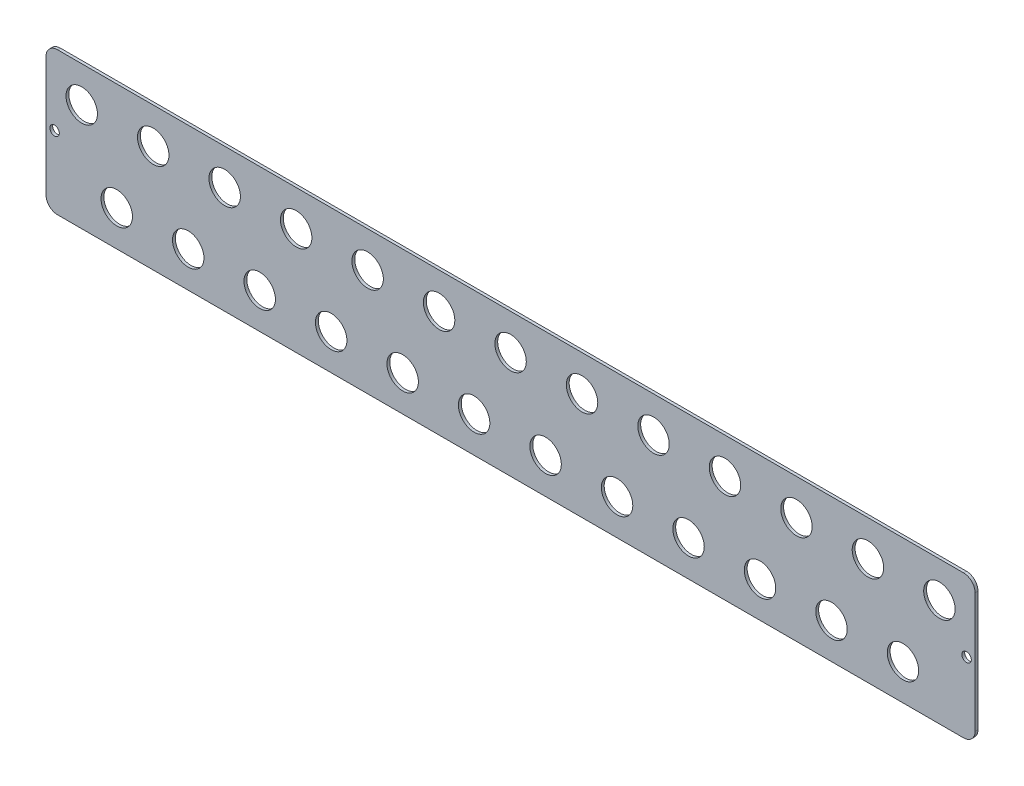
ISO-10303-21;
HEADER;
FILE_DESCRIPTION(('STEP AP214'),'2;1');
FILE_NAME('part.step','',(''),(''),'','','');
FILE_SCHEMA(('AUTOMOTIVE_DESIGN { 1 0 10303 214 1 1 1 1 }'));
ENDSEC;
DATA;
#1=APPLICATION_CONTEXT('core data for automotive mechanical design processes');
#2=APPLICATION_PROTOCOL_DEFINITION('international standard','automotive_design',2000,#1);
#3=PRODUCT_CONTEXT('',#1,'mechanical');
#4=PRODUCT('Part','Part','',(#3));
#5=PRODUCT_RELATED_PRODUCT_CATEGORY('part','',(#4));
#6=PRODUCT_DEFINITION_FORMATION('','',#4);
#7=PRODUCT_DEFINITION_CONTEXT('part definition',#1,'design');
#8=PRODUCT_DEFINITION('design','',#6,#7);
#9=PRODUCT_DEFINITION_SHAPE('','',#8);
#10=(LENGTH_UNIT() NAMED_UNIT(*) SI_UNIT(.MILLI.,.METRE.));
#11=(NAMED_UNIT(*) PLANE_ANGLE_UNIT() SI_UNIT($,.RADIAN.));
#12=(NAMED_UNIT(*) SI_UNIT($,.STERADIAN.) SOLID_ANGLE_UNIT());
#13=UNCERTAINTY_MEASURE_WITH_UNIT(LENGTH_MEASURE(1.E-05),#10,'distance_accuracy_value','');
#14=(GEOMETRIC_REPRESENTATION_CONTEXT(3) GLOBAL_UNCERTAINTY_ASSIGNED_CONTEXT((#13)) GLOBAL_UNIT_ASSIGNED_CONTEXT((#10,
#11,#12)) REPRESENTATION_CONTEXT('',''));
#15=CARTESIAN_POINT('',(0.,0.,0.));
#16=DIRECTION('',(0.,0.,1.));
#17=DIRECTION('',(1.,0.,0.));
#18=AXIS2_PLACEMENT_3D('',#15,#16,#17);
#19=CARTESIAN_POINT('',(316.901308233038,-41.9013082330377,2.));
#20=DIRECTION('',(0.,0.,-1.));
#21=DIRECTION('',(-1.,0.,0.));
#22=AXIS2_PLACEMENT_3D('',#19,#20,#21);
#23=CYLINDRICAL_SURFACE('',#22,8.09869176696232);
#24=CARTESIAN_POINT('',(316.901308233038,-41.9013082330377,0.));
#25=DIRECTION('',(0.,0.,1.));
#26=DIRECTION('',(1.,0.,0.));
#27=AXIS2_PLACEMENT_3D('',#24,#25,#26);
#28=CIRCLE('',#27,8.09869176696232);
#29=CARTESIAN_POINT('',(316.901308233038,-50.,0.));
#30=VERTEX_POINT('',#29);
#31=CARTESIAN_POINT('',(325.,-41.9013082330377,0.));
#32=VERTEX_POINT('',#31);
#33=EDGE_CURVE('E134',#30,#32,#28,.T.);
#34=ORIENTED_EDGE('',*,*,#33,.T.);
#35=DIRECTION('',(0.,0.,-1.));
#36=VECTOR('',#35,1.);
#37=CARTESIAN_POINT('',(325.,-41.9013082330377,2.));
#38=LINE('',#37,#36);
#39=CARTESIAN_POINT('',(325.,-41.9013082330377,2.));
#40=VERTEX_POINT('',#39);
#41=EDGE_CURVE('E162',#40,#32,#38,.T.);
#42=ORIENTED_EDGE('',*,*,#41,.F.);
#43=CARTESIAN_POINT('',(316.901308233038,-41.9013082330377,2.));
#44=DIRECTION('',(0.,0.,1.));
#45=DIRECTION('',(1.,0.,0.));
#46=AXIS2_PLACEMENT_3D('',#43,#44,#45);
#47=CIRCLE('',#46,8.09869176696232);
#48=CARTESIAN_POINT('',(316.901308233038,-50.,2.));
#49=VERTEX_POINT('',#48);
#50=EDGE_CURVE('E149',#49,#40,#47,.T.);
#51=ORIENTED_EDGE('',*,*,#50,.F.);
#52=DIRECTION('',(0.,0.,-1.));
#53=VECTOR('',#52,1.);
#54=CARTESIAN_POINT('',(316.901308233038,-50.,2.));
#55=LINE('',#54,#53);
#56=EDGE_CURVE('E130',#49,#30,#55,.T.);
#57=ORIENTED_EDGE('',*,*,#56,.T.);
#58=EDGE_LOOP('',(#34,#42,#51,#57));
#59=FACE_BOUND('',#58,.T.);
#60=ADVANCED_FACE('F33',(#59),#23,.T.);
#61=CARTESIAN_POINT('',(325.,-41.9013082330377,2.));
#62=DIRECTION('',(-1.,0.,0.));
#63=DIRECTION('',(0.,0.,1.));
#64=AXIS2_PLACEMENT_3D('',#61,#62,#63);
#65=PLANE('',#64);
#66=DIRECTION('',(0.,1.,0.));
#67=VECTOR('',#66,1.);
#68=CARTESIAN_POINT('',(325.,-41.9013082330377,0.));
#69=LINE('',#68,#67);
#70=CARTESIAN_POINT('',(325.,41.9013082330377,0.));
#71=VERTEX_POINT('',#70);
#72=EDGE_CURVE('E137',#32,#71,#69,.T.);
#73=ORIENTED_EDGE('',*,*,#72,.T.);
#74=DIRECTION('',(0.,0.,-1.));
#75=VECTOR('',#74,1.);
#76=CARTESIAN_POINT('',(325.,41.9013082330377,2.));
#77=LINE('',#76,#75);
#78=CARTESIAN_POINT('',(325.,41.9013082330377,2.));
#79=VERTEX_POINT('',#78);
#80=EDGE_CURVE('E159',#79,#71,#77,.T.);
#81=ORIENTED_EDGE('',*,*,#80,.F.);
#82=DIRECTION('',(0.,1.,0.));
#83=VECTOR('',#82,1.);
#84=CARTESIAN_POINT('',(325.,-41.9013082330377,2.));
#85=LINE('',#84,#83);
#86=EDGE_CURVE('E96',#40,#79,#85,.T.);
#87=ORIENTED_EDGE('',*,*,#86,.F.);
#88=ORIENTED_EDGE('',*,*,#41,.T.);
#89=EDGE_LOOP('',(#73,#81,#87,#88));
#90=FACE_BOUND('',#89,.T.);
#91=ADVANCED_FACE('F345',(#90),#65,.F.);
#92=CARTESIAN_POINT('',(316.901308233038,41.9013082330377,2.));
#93=DIRECTION('',(0.,0.,-1.));
#94=DIRECTION('',(-1.,0.,0.));
#95=AXIS2_PLACEMENT_3D('',#92,#93,#94);
#96=CYLINDRICAL_SURFACE('',#95,8.09869176696232);
#97=CARTESIAN_POINT('',(316.901308233038,41.9013082330377,0.));
#98=DIRECTION('',(0.,0.,1.));
#99=DIRECTION('',(1.,0.,0.));
#100=AXIS2_PLACEMENT_3D('',#97,#98,#99);
#101=CIRCLE('',#100,8.09869176696232);
#102=CARTESIAN_POINT('',(316.901308233038,50.,0.));
#103=VERTEX_POINT('',#102);
#104=EDGE_CURVE('E140',#71,#103,#101,.T.);
#105=ORIENTED_EDGE('',*,*,#104,.T.);
#106=DIRECTION('',(0.,0.,-1.));
#107=VECTOR('',#106,1.);
#108=CARTESIAN_POINT('',(316.901308233038,50.,2.));
#109=LINE('',#108,#107);
#110=CARTESIAN_POINT('',(316.901308233038,50.,2.));
#111=VERTEX_POINT('',#110);
#112=EDGE_CURVE('E156',#111,#103,#109,.T.);
#113=ORIENTED_EDGE('',*,*,#112,.F.);
#114=CARTESIAN_POINT('',(316.901308233038,41.9013082330377,2.));
#115=DIRECTION('',(0.,0.,1.));
#116=DIRECTION('',(1.,0.,0.));
#117=AXIS2_PLACEMENT_3D('',#114,#115,#116);
#118=CIRCLE('',#117,8.09869176696232);
#119=EDGE_CURVE('E312',#79,#111,#118,.T.);
#120=ORIENTED_EDGE('',*,*,#119,.F.);
#121=ORIENTED_EDGE('',*,*,#80,.T.);
#122=EDGE_LOOP('',(#105,#113,#120,#121));
#123=FACE_BOUND('',#122,.T.);
#124=ADVANCED_FACE('F350',(#123),#96,.T.);
#125=CARTESIAN_POINT('',(-316.901308233038,50.,2.));
#126=DIRECTION('',(0.,-1.,0.));
#127=DIRECTION('',(0.,0.,-1.));
#128=AXIS2_PLACEMENT_3D('',#125,#126,#127);
#129=PLANE('',#128);
#130=DIRECTION('',(-1.,0.,0.));
#131=VECTOR('',#130,1.);
#132=CARTESIAN_POINT('',(-316.901308233038,50.,0.));
#133=LINE('',#132,#131);
#134=CARTESIAN_POINT('',(-316.901308233038,50.,0.));
#135=VERTEX_POINT('',#134);
#136=EDGE_CURVE('E142',#103,#135,#133,.T.);
#137=ORIENTED_EDGE('',*,*,#136,.T.);
#138=DIRECTION('',(0.,0.,-1.));
#139=VECTOR('',#138,1.);
#140=CARTESIAN_POINT('',(-316.901308233038,50.,2.));
#141=LINE('',#140,#139);
#142=CARTESIAN_POINT('',(-316.901308233038,50.,2.));
#143=VERTEX_POINT('',#142);
#144=EDGE_CURVE('E153',#143,#135,#141,.T.);
#145=ORIENTED_EDGE('',*,*,#144,.F.);
#146=DIRECTION('',(-1.,0.,0.));
#147=VECTOR('',#146,1.);
#148=CARTESIAN_POINT('',(-316.901308233038,50.,2.));
#149=LINE('',#148,#147);
#150=EDGE_CURVE('E314',#111,#143,#149,.T.);
#151=ORIENTED_EDGE('',*,*,#150,.F.);
#152=ORIENTED_EDGE('',*,*,#112,.T.);
#153=EDGE_LOOP('',(#137,#145,#151,#152));
#154=FACE_BOUND('',#153,.T.);
#155=ADVANCED_FACE('F320',(#154),#129,.F.);
#156=CARTESIAN_POINT('',(-316.901308233038,41.9013082330377,2.));
#157=DIRECTION('',(0.,0.,-1.));
#158=DIRECTION('',(-1.,0.,0.));
#159=AXIS2_PLACEMENT_3D('',#156,#157,#158);
#160=CYLINDRICAL_SURFACE('',#159,8.09869176696232);
#161=CARTESIAN_POINT('',(-316.901308233038,41.9013082330377,0.));
#162=DIRECTION('',(0.,0.,1.));
#163=DIRECTION('',(-1.,0.,0.));
#164=AXIS2_PLACEMENT_3D('',#161,#162,#163);
#165=CIRCLE('',#164,8.09869176696232);
#166=CARTESIAN_POINT('',(-325.,41.9013082330377,0.));
#167=VERTEX_POINT('',#166);
#168=EDGE_CURVE('E144',#135,#167,#165,.T.);
#169=ORIENTED_EDGE('',*,*,#168,.T.);
#170=DIRECTION('',(0.,0.,-1.));
#171=VECTOR('',#170,1.);
#172=CARTESIAN_POINT('',(-325.,41.9013082330377,2.));
#173=LINE('',#172,#171);
#174=CARTESIAN_POINT('',(-325.,41.9013082330377,2.));
#175=VERTEX_POINT('',#174);
#176=EDGE_CURVE('E125',#175,#167,#173,.T.);
#177=ORIENTED_EDGE('',*,*,#176,.F.);
#178=CARTESIAN_POINT('',(-316.901308233038,41.9013082330377,2.));
#179=DIRECTION('',(0.,0.,1.));
#180=DIRECTION('',(-1.,0.,0.));
#181=AXIS2_PLACEMENT_3D('',#178,#179,#180);
#182=CIRCLE('',#181,8.09869176696232);
#183=EDGE_CURVE('E116',#143,#175,#182,.T.);
#184=ORIENTED_EDGE('',*,*,#183,.F.);
#185=ORIENTED_EDGE('',*,*,#144,.T.);
#186=EDGE_LOOP('',(#169,#177,#184,#185));
#187=FACE_BOUND('',#186,.T.);
#188=ADVANCED_FACE('F324',(#187),#160,.T.);
#189=CARTESIAN_POINT('',(-325.,-41.9013082330377,2.));
#190=DIRECTION('',(1.,0.,0.));
#191=DIRECTION('',(0.,0.,-1.));
#192=AXIS2_PLACEMENT_3D('',#189,#190,#191);
#193=PLANE('',#192);
#194=DIRECTION('',(0.,-1.,0.));
#195=VECTOR('',#194,1.);
#196=CARTESIAN_POINT('',(-325.,-41.9013082330377,0.));
#197=LINE('',#196,#195);
#198=CARTESIAN_POINT('',(-325.,-41.9013082330377,0.));
#199=VERTEX_POINT('',#198);
#200=EDGE_CURVE('E124',#167,#199,#197,.T.);
#201=ORIENTED_EDGE('',*,*,#200,.T.);
#202=DIRECTION('',(0.,0.,-1.));
#203=VECTOR('',#202,1.);
#204=CARTESIAN_POINT('',(-325.,-41.9013082330377,2.));
#205=LINE('',#204,#203);
#206=CARTESIAN_POINT('',(-325.,-41.9013082330377,2.));
#207=VERTEX_POINT('',#206);
#208=EDGE_CURVE('E121',#207,#199,#205,.T.);
#209=ORIENTED_EDGE('',*,*,#208,.F.);
#210=DIRECTION('',(0.,-1.,0.));
#211=VECTOR('',#210,1.);
#212=CARTESIAN_POINT('',(-325.,-41.9013082330377,2.));
#213=LINE('',#212,#211);
#214=EDGE_CURVE('E109',#175,#207,#213,.T.);
#215=ORIENTED_EDGE('',*,*,#214,.F.);
#216=ORIENTED_EDGE('',*,*,#176,.T.);
#217=EDGE_LOOP('',(#201,#209,#215,#216));
#218=FACE_BOUND('',#217,.T.);
#219=ADVANCED_FACE('F122',(#218),#193,.F.);
#220=CARTESIAN_POINT('',(-316.901308233038,-41.9013082330377,2.));
#221=DIRECTION('',(0.,0.,-1.));
#222=DIRECTION('',(-1.,0.,0.));
#223=AXIS2_PLACEMENT_3D('',#220,#221,#222);
#224=CYLINDRICAL_SURFACE('',#223,8.09869176696232);
#225=CARTESIAN_POINT('',(-316.901308233038,-41.9013082330377,0.));
#226=DIRECTION('',(0.,0.,1.));
#227=DIRECTION('',(-1.,0.,0.));
#228=AXIS2_PLACEMENT_3D('',#225,#226,#227);
#229=CIRCLE('',#228,8.09869176696232);
#230=CARTESIAN_POINT('',(-316.901308233038,-50.,0.));
#231=VERTEX_POINT('',#230);
#232=EDGE_CURVE('E81',#199,#231,#229,.T.);
#233=ORIENTED_EDGE('',*,*,#232,.T.);
#234=DIRECTION('',(0.,0.,-1.));
#235=VECTOR('',#234,1.);
#236=CARTESIAN_POINT('',(-316.901308233038,-50.,2.));
#237=LINE('',#236,#235);
#238=CARTESIAN_POINT('',(-316.901308233038,-50.,2.));
#239=VERTEX_POINT('',#238);
#240=EDGE_CURVE('E126',#239,#231,#237,.T.);
#241=ORIENTED_EDGE('',*,*,#240,.F.);
#242=CARTESIAN_POINT('',(-316.901308233038,-41.9013082330377,2.));
#243=DIRECTION('',(0.,0.,1.));
#244=DIRECTION('',(-1.,0.,0.));
#245=AXIS2_PLACEMENT_3D('',#242,#243,#244);
#246=CIRCLE('',#245,8.09869176696232);
#247=EDGE_CURVE('E114',#207,#239,#246,.T.);
#248=ORIENTED_EDGE('',*,*,#247,.F.);
#249=ORIENTED_EDGE('',*,*,#208,.T.);
#250=EDGE_LOOP('',(#233,#241,#248,#249));
#251=FACE_BOUND('',#250,.T.);
#252=ADVANCED_FACE('F128',(#251),#224,.T.);
#253=CARTESIAN_POINT('',(-316.901308233038,-50.,2.));
#254=DIRECTION('',(0.,1.,0.));
#255=DIRECTION('',(0.,0.,1.));
#256=AXIS2_PLACEMENT_3D('',#253,#254,#255);
#257=PLANE('',#256);
#258=DIRECTION('',(1.,0.,0.));
#259=VECTOR('',#258,1.);
#260=CARTESIAN_POINT('',(-316.901308233038,-50.,0.));
#261=LINE('',#260,#259);
#262=EDGE_CURVE('E87',#231,#30,#261,.T.);
#263=ORIENTED_EDGE('',*,*,#262,.T.);
#264=ORIENTED_EDGE('',*,*,#56,.F.);
#265=DIRECTION('',(1.,0.,0.));
#266=VECTOR('',#265,1.);
#267=CARTESIAN_POINT('',(-316.901308233038,-50.,2.));
#268=LINE('',#267,#266);
#269=EDGE_CURVE('E52',#239,#49,#268,.T.);
#270=ORIENTED_EDGE('',*,*,#269,.F.);
#271=ORIENTED_EDGE('',*,*,#240,.T.);
#272=EDGE_LOOP('',(#263,#264,#270,#271));
#273=FACE_BOUND('',#272,.T.);
#274=ADVANCED_FACE('F333',(#273),#257,.F.);
#275=CARTESIAN_POINT('',(316.901308233038,-41.9013082330377,2.));
#276=DIRECTION('',(0.,0.,1.));
#277=DIRECTION('',(1.,0.,0.));
#278=AXIS2_PLACEMENT_3D('',#275,#276,#277);
#279=PLANE('',#278);
#280=CARTESIAN_POINT('',(-319.,0.,2.));
#281=DIRECTION('',(0.,0.,1.));
#282=DIRECTION('',(1.,0.,0.));
#283=AXIS2_PLACEMENT_3D('',#280,#281,#282);
#284=CIRCLE('',#283,3.29999999999997);
#285=CARTESIAN_POINT('',(-315.7,0.,2.));
#286=VERTEX_POINT('',#285);
#287=EDGE_CURVE('E477',#286,#286,#284,.T.);
#288=ORIENTED_EDGE('',*,*,#287,.F.);
#289=EDGE_LOOP('',(#288));
#290=FACE_BOUND('',#289,.T.);
#291=CARTESIAN_POINT('',(319.,0.,2.));
#292=DIRECTION('',(0.,0.,1.));
#293=DIRECTION('',(1.,0.,0.));
#294=AXIS2_PLACEMENT_3D('',#291,#292,#293);
#295=CIRCLE('',#294,3.29999999999997);
#296=CARTESIAN_POINT('',(322.3,0.,2.));
#297=VERTEX_POINT('',#296);
#298=EDGE_CURVE('E485',#297,#297,#295,.T.);
#299=ORIENTED_EDGE('',*,*,#298,.F.);
#300=EDGE_LOOP('',(#299));
#301=FACE_BOUND('',#300,.T.);
#302=CARTESIAN_POINT('',(-275.5,-25.,2.));
#303=DIRECTION('',(0.,0.,1.));
#304=DIRECTION('',(1.,0.,0.));
#305=AXIS2_PLACEMENT_3D('',#302,#303,#304);
#306=CIRCLE('',#305,11.);
#307=CARTESIAN_POINT('',(-264.5,-25.,2.));
#308=VERTEX_POINT('',#307);
#309=EDGE_CURVE('E277',#308,#308,#306,.T.);
#310=ORIENTED_EDGE('',*,*,#309,.F.);
#311=EDGE_LOOP('',(#310));
#312=FACE_BOUND('',#311,.T.);
#313=CARTESIAN_POINT('',(-225.5,-25.,2.));
#314=DIRECTION('',(0.,0.,1.));
#315=DIRECTION('',(1.,0.,0.));
#316=AXIS2_PLACEMENT_3D('',#313,#314,#315);
#317=CIRCLE('',#316,11.);
#318=CARTESIAN_POINT('',(-214.5,-25.,2.));
#319=VERTEX_POINT('',#318);
#320=EDGE_CURVE('E267',#319,#319,#317,.T.);
#321=ORIENTED_EDGE('',*,*,#320,.F.);
#322=EDGE_LOOP('',(#321));
#323=FACE_BOUND('',#322,.T.);
#324=CARTESIAN_POINT('',(-175.5,-25.,2.));
#325=DIRECTION('',(0.,0.,1.));
#326=DIRECTION('',(1.,0.,0.));
#327=AXIS2_PLACEMENT_3D('',#324,#325,#326);
#328=CIRCLE('',#327,11.);
#329=CARTESIAN_POINT('',(-164.5,-25.,2.));
#330=VERTEX_POINT('',#329);
#331=EDGE_CURVE('E264',#330,#330,#328,.T.);
#332=ORIENTED_EDGE('',*,*,#331,.F.);
#333=EDGE_LOOP('',(#332));
#334=FACE_BOUND('',#333,.T.);
#335=CARTESIAN_POINT('',(-125.5,-25.,2.));
#336=DIRECTION('',(0.,0.,1.));
#337=DIRECTION('',(1.,0.,0.));
#338=AXIS2_PLACEMENT_3D('',#335,#336,#337);
#339=CIRCLE('',#338,11.);
#340=CARTESIAN_POINT('',(-114.5,-25.,2.));
#341=VERTEX_POINT('',#340);
#342=EDGE_CURVE('E261',#341,#341,#339,.T.);
#343=ORIENTED_EDGE('',*,*,#342,.F.);
#344=EDGE_LOOP('',(#343));
#345=FACE_BOUND('',#344,.T.);
#346=CARTESIAN_POINT('',(-75.5000000000001,-25.,2.));
#347=DIRECTION('',(0.,0.,1.));
#348=DIRECTION('',(1.,0.,0.));
#349=AXIS2_PLACEMENT_3D('',#346,#347,#348);
#350=CIRCLE('',#349,11.);
#351=CARTESIAN_POINT('',(-64.5000000000001,-25.,2.));
#352=VERTEX_POINT('',#351);
#353=EDGE_CURVE('E257',#352,#352,#350,.T.);
#354=ORIENTED_EDGE('',*,*,#353,.F.);
#355=EDGE_LOOP('',(#354));
#356=FACE_BOUND('',#355,.T.);
#357=CARTESIAN_POINT('',(-25.5000000000001,-25.,2.));
#358=DIRECTION('',(0.,0.,1.));
#359=DIRECTION('',(1.,0.,0.));
#360=AXIS2_PLACEMENT_3D('',#357,#358,#359);
#361=CIRCLE('',#360,11.);
#362=CARTESIAN_POINT('',(-14.5000000000001,-25.,2.));
#363=VERTEX_POINT('',#362);
#364=EDGE_CURVE('E253',#363,#363,#361,.T.);
#365=ORIENTED_EDGE('',*,*,#364,.F.);
#366=EDGE_LOOP('',(#365));
#367=FACE_BOUND('',#366,.T.);
#368=CARTESIAN_POINT('',(24.5,-25.,2.));
#369=DIRECTION('',(0.,0.,1.));
#370=DIRECTION('',(1.,0.,0.));
#371=AXIS2_PLACEMENT_3D('',#368,#369,#370);
#372=CIRCLE('',#371,11.);
#373=CARTESIAN_POINT('',(35.5,-25.,2.));
#374=VERTEX_POINT('',#373);
#375=EDGE_CURVE('E249',#374,#374,#372,.T.);
#376=ORIENTED_EDGE('',*,*,#375,.F.);
#377=EDGE_LOOP('',(#376));
#378=FACE_BOUND('',#377,.T.);
#379=CARTESIAN_POINT('',(74.5,-25.,2.));
#380=DIRECTION('',(0.,0.,1.));
#381=DIRECTION('',(1.,0.,0.));
#382=AXIS2_PLACEMENT_3D('',#379,#380,#381);
#383=CIRCLE('',#382,11.);
#384=CARTESIAN_POINT('',(85.5,-25.,2.));
#385=VERTEX_POINT('',#384);
#386=EDGE_CURVE('E245',#385,#385,#383,.T.);
#387=ORIENTED_EDGE('',*,*,#386,.F.);
#388=EDGE_LOOP('',(#387));
#389=FACE_BOUND('',#388,.T.);
#390=CARTESIAN_POINT('',(124.5,-25.,2.));
#391=DIRECTION('',(0.,0.,1.));
#392=DIRECTION('',(1.,0.,0.));
#393=AXIS2_PLACEMENT_3D('',#390,#391,#392);
#394=CIRCLE('',#393,11.);
#395=CARTESIAN_POINT('',(135.5,-25.,2.));
#396=VERTEX_POINT('',#395);
#397=EDGE_CURVE('E241',#396,#396,#394,.T.);
#398=ORIENTED_EDGE('',*,*,#397,.F.);
#399=EDGE_LOOP('',(#398));
#400=FACE_BOUND('',#399,.T.);
#401=CARTESIAN_POINT('',(174.5,-25.,2.));
#402=DIRECTION('',(0.,0.,1.));
#403=DIRECTION('',(1.,0.,0.));
#404=AXIS2_PLACEMENT_3D('',#401,#402,#403);
#405=CIRCLE('',#404,11.);
#406=CARTESIAN_POINT('',(185.5,-25.,2.));
#407=VERTEX_POINT('',#406);
#408=EDGE_CURVE('E237',#407,#407,#405,.T.);
#409=ORIENTED_EDGE('',*,*,#408,.F.);
#410=EDGE_LOOP('',(#409));
#411=FACE_BOUND('',#410,.T.);
#412=CARTESIAN_POINT('',(224.5,-25.,2.));
#413=DIRECTION('',(0.,0.,1.));
#414=DIRECTION('',(1.,0.,0.));
#415=AXIS2_PLACEMENT_3D('',#412,#413,#414);
#416=CIRCLE('',#415,11.);
#417=CARTESIAN_POINT('',(235.5,-25.,2.));
#418=VERTEX_POINT('',#417);
#419=EDGE_CURVE('E233',#418,#418,#416,.T.);
#420=ORIENTED_EDGE('',*,*,#419,.F.);
#421=EDGE_LOOP('',(#420));
#422=FACE_BOUND('',#421,.T.);
#423=CARTESIAN_POINT('',(274.5,-25.,2.));
#424=DIRECTION('',(0.,0.,1.));
#425=DIRECTION('',(1.,0.,0.));
#426=AXIS2_PLACEMENT_3D('',#423,#424,#425);
#427=CIRCLE('',#426,11.);
#428=CARTESIAN_POINT('',(285.5,-25.,2.));
#429=VERTEX_POINT('',#428);
#430=EDGE_CURVE('E232',#429,#429,#427,.T.);
#431=ORIENTED_EDGE('',*,*,#430,.F.);
#432=EDGE_LOOP('',(#431));
#433=FACE_BOUND('',#432,.T.);
#434=CARTESIAN_POINT('',(250.,25.,2.));
#435=DIRECTION('',(0.,0.,1.));
#436=DIRECTION('',(1.,0.,0.));
#437=AXIS2_PLACEMENT_3D('',#434,#435,#436);
#438=CIRCLE('',#437,11.);
#439=CARTESIAN_POINT('',(261.,25.,2.));
#440=VERTEX_POINT('',#439);
#441=EDGE_CURVE('E302',#440,#440,#438,.T.);
#442=ORIENTED_EDGE('',*,*,#441,.F.);
#443=EDGE_LOOP('',(#442));
#444=FACE_BOUND('',#443,.T.);
#445=CARTESIAN_POINT('',(300.,25.,2.));
#446=DIRECTION('',(0.,0.,1.));
#447=DIRECTION('',(1.,0.,0.));
#448=AXIS2_PLACEMENT_3D('',#445,#446,#447);
#449=CIRCLE('',#448,11.);
#450=CARTESIAN_POINT('',(311.,25.,2.));
#451=VERTEX_POINT('',#450);
#452=EDGE_CURVE('E167',#451,#451,#449,.T.);
#453=ORIENTED_EDGE('',*,*,#452,.F.);
#454=EDGE_LOOP('',(#453));
#455=FACE_BOUND('',#454,.T.);
#456=ORIENTED_EDGE('',*,*,#50,.T.);
#457=ORIENTED_EDGE('',*,*,#86,.T.);
#458=ORIENTED_EDGE('',*,*,#119,.T.);
#459=ORIENTED_EDGE('',*,*,#150,.T.);
#460=ORIENTED_EDGE('',*,*,#183,.T.);
#461=ORIENTED_EDGE('',*,*,#214,.T.);
#462=ORIENTED_EDGE('',*,*,#247,.T.);
#463=ORIENTED_EDGE('',*,*,#269,.T.);
#464=EDGE_LOOP('',(#456,#457,#458,#459,#460,#461,#462,#463));
#465=FACE_BOUND('',#464,.T.);
#466=CARTESIAN_POINT('',(200.,25.,2.));
#467=DIRECTION('',(0.,0.,1.));
#468=DIRECTION('',(1.,0.,0.));
#469=AXIS2_PLACEMENT_3D('',#466,#467,#468);
#470=CIRCLE('',#469,11.);
#471=CARTESIAN_POINT('',(211.,25.,2.));
#472=VERTEX_POINT('',#471);
#473=EDGE_CURVE('E164',#472,#472,#470,.T.);
#474=ORIENTED_EDGE('',*,*,#473,.F.);
#475=EDGE_LOOP('',(#474));
#476=FACE_BOUND('',#475,.T.);
#477=CARTESIAN_POINT('',(150.,25.,2.));
#478=DIRECTION('',(0.,0.,1.));
#479=DIRECTION('',(1.,0.,0.));
#480=AXIS2_PLACEMENT_3D('',#477,#478,#479);
#481=CIRCLE('',#480,11.);
#482=CARTESIAN_POINT('',(161.,25.,2.));
#483=VERTEX_POINT('',#482);
#484=EDGE_CURVE('E173',#483,#483,#481,.T.);
#485=ORIENTED_EDGE('',*,*,#484,.F.);
#486=EDGE_LOOP('',(#485));
#487=FACE_BOUND('',#486,.T.);
#488=CARTESIAN_POINT('',(100.,25.,2.));
#489=DIRECTION('',(0.,0.,1.));
#490=DIRECTION('',(1.,0.,0.));
#491=AXIS2_PLACEMENT_3D('',#488,#489,#490);
#492=CIRCLE('',#491,11.);
#493=CARTESIAN_POINT('',(111.,25.,2.));
#494=VERTEX_POINT('',#493);
#495=EDGE_CURVE('E179',#494,#494,#492,.T.);
#496=ORIENTED_EDGE('',*,*,#495,.F.);
#497=EDGE_LOOP('',(#496));
#498=FACE_BOUND('',#497,.T.);
#499=CARTESIAN_POINT('',(50.,25.,2.));
#500=DIRECTION('',(0.,0.,1.));
#501=DIRECTION('',(1.,0.,0.));
#502=AXIS2_PLACEMENT_3D('',#499,#500,#501);
#503=CIRCLE('',#502,11.);
#504=CARTESIAN_POINT('',(61.,25.,2.));
#505=VERTEX_POINT('',#504);
#506=EDGE_CURVE('E185',#505,#505,#503,.T.);
#507=ORIENTED_EDGE('',*,*,#506,.F.);
#508=EDGE_LOOP('',(#507));
#509=FACE_BOUND('',#508,.T.);
#510=CARTESIAN_POINT('',(0.,25.,2.));
#511=DIRECTION('',(0.,0.,1.));
#512=DIRECTION('',(1.,0.,0.));
#513=AXIS2_PLACEMENT_3D('',#510,#511,#512);
#514=CIRCLE('',#513,11.);
#515=CARTESIAN_POINT('',(11.,25.,2.));
#516=VERTEX_POINT('',#515);
#517=EDGE_CURVE('E191',#516,#516,#514,.T.);
#518=ORIENTED_EDGE('',*,*,#517,.F.);
#519=EDGE_LOOP('',(#518));
#520=FACE_BOUND('',#519,.T.);
#521=CARTESIAN_POINT('',(-50.,25.,2.));
#522=DIRECTION('',(0.,0.,1.));
#523=DIRECTION('',(1.,0.,0.));
#524=AXIS2_PLACEMENT_3D('',#521,#522,#523);
#525=CIRCLE('',#524,11.);
#526=CARTESIAN_POINT('',(-39.,25.,2.));
#527=VERTEX_POINT('',#526);
#528=EDGE_CURVE('E197',#527,#527,#525,.T.);
#529=ORIENTED_EDGE('',*,*,#528,.F.);
#530=EDGE_LOOP('',(#529));
#531=FACE_BOUND('',#530,.T.);
#532=CARTESIAN_POINT('',(-100.,25.,2.));
#533=DIRECTION('',(0.,0.,1.));
#534=DIRECTION('',(1.,0.,0.));
#535=AXIS2_PLACEMENT_3D('',#532,#533,#534);
#536=CIRCLE('',#535,11.);
#537=CARTESIAN_POINT('',(-89.,25.,2.));
#538=VERTEX_POINT('',#537);
#539=EDGE_CURVE('E203',#538,#538,#536,.T.);
#540=ORIENTED_EDGE('',*,*,#539,.F.);
#541=EDGE_LOOP('',(#540));
#542=FACE_BOUND('',#541,.T.);
#543=CARTESIAN_POINT('',(-150.,25.,2.));
#544=DIRECTION('',(0.,0.,1.));
#545=DIRECTION('',(1.,0.,0.));
#546=AXIS2_PLACEMENT_3D('',#543,#544,#545);
#547=CIRCLE('',#546,11.);
#548=CARTESIAN_POINT('',(-139.,25.,2.));
#549=VERTEX_POINT('',#548);
#550=EDGE_CURVE('E209',#549,#549,#547,.T.);
#551=ORIENTED_EDGE('',*,*,#550,.F.);
#552=EDGE_LOOP('',(#551));
#553=FACE_BOUND('',#552,.T.);
#554=CARTESIAN_POINT('',(-200.,25.,2.));
#555=DIRECTION('',(0.,0.,1.));
#556=DIRECTION('',(1.,0.,0.));
#557=AXIS2_PLACEMENT_3D('',#554,#555,#556);
#558=CIRCLE('',#557,11.);
#559=CARTESIAN_POINT('',(-189.,25.,2.));
#560=VERTEX_POINT('',#559);
#561=EDGE_CURVE('E215',#560,#560,#558,.T.);
#562=ORIENTED_EDGE('',*,*,#561,.F.);
#563=EDGE_LOOP('',(#562));
#564=FACE_BOUND('',#563,.T.);
#565=CARTESIAN_POINT('',(-250.,25.,2.));
#566=DIRECTION('',(0.,0.,1.));
#567=DIRECTION('',(1.,0.,0.));
#568=AXIS2_PLACEMENT_3D('',#565,#566,#567);
#569=CIRCLE('',#568,11.);
#570=CARTESIAN_POINT('',(-239.,25.,2.));
#571=VERTEX_POINT('',#570);
#572=EDGE_CURVE('E221',#571,#571,#569,.T.);
#573=ORIENTED_EDGE('',*,*,#572,.F.);
#574=EDGE_LOOP('',(#573));
#575=FACE_BOUND('',#574,.T.);
#576=CARTESIAN_POINT('',(-300.,25.,2.));
#577=DIRECTION('',(0.,0.,1.));
#578=DIRECTION('',(1.,0.,0.));
#579=AXIS2_PLACEMENT_3D('',#576,#577,#578);
#580=CIRCLE('',#579,11.);
#581=CARTESIAN_POINT('',(-289.,25.,2.));
#582=VERTEX_POINT('',#581);
#583=EDGE_CURVE('E43',#582,#582,#580,.T.);
#584=ORIENTED_EDGE('',*,*,#583,.F.);
#585=EDGE_LOOP('',(#584));
#586=FACE_BOUND('',#585,.T.);
#587=ADVANCED_FACE('F111',(#290,#301,#312,#323,#334,#345,#356,#367,#378,#389,#400,#411,#422,
#433,#444,#455,#465,#476,#487,#498,#509,#520,#531,#542,#553,#564,#575,#586),#279,.T.);
#588=CARTESIAN_POINT('',(316.901308233038,-41.9013082330377,0.));
#589=DIRECTION('',(0.,0.,1.));
#590=DIRECTION('',(1.,0.,0.));
#591=AXIS2_PLACEMENT_3D('',#588,#589,#590);
#592=PLANE('',#591);
#593=CARTESIAN_POINT('',(-319.,0.,0.));
#594=DIRECTION('',(0.,0.,-1.));
#595=DIRECTION('',(-1.,0.,0.));
#596=AXIS2_PLACEMENT_3D('',#593,#594,#595);
#597=CIRCLE('',#596,3.29999999999997);
#598=CARTESIAN_POINT('',(-322.3,0.,0.));
#599=VERTEX_POINT('',#598);
#600=EDGE_CURVE('E479',#599,#599,#597,.T.);
#601=ORIENTED_EDGE('',*,*,#600,.F.);
#602=EDGE_LOOP('',(#601));
#603=FACE_BOUND('',#602,.T.);
#604=CARTESIAN_POINT('',(319.,0.,0.));
#605=DIRECTION('',(0.,0.,-1.));
#606=DIRECTION('',(-1.,0.,0.));
#607=AXIS2_PLACEMENT_3D('',#604,#605,#606);
#608=CIRCLE('',#607,3.29999999999997);
#609=CARTESIAN_POINT('',(315.7,0.,0.));
#610=VERTEX_POINT('',#609);
#611=EDGE_CURVE('E481',#610,#610,#608,.T.);
#612=ORIENTED_EDGE('',*,*,#611,.F.);
#613=EDGE_LOOP('',(#612));
#614=FACE_BOUND('',#613,.T.);
#615=CARTESIAN_POINT('',(-275.5,-25.,0.));
#616=DIRECTION('',(0.,0.,1.));
#617=DIRECTION('',(1.,0.,0.));
#618=AXIS2_PLACEMENT_3D('',#615,#616,#617);
#619=CIRCLE('',#618,11.);
#620=CARTESIAN_POINT('',(-264.5,-25.,0.));
#621=VERTEX_POINT('',#620);
#622=EDGE_CURVE('E37',#621,#621,#619,.T.);
#623=ORIENTED_EDGE('',*,*,#622,.T.);
#624=EDGE_LOOP('',(#623));
#625=FACE_BOUND('',#624,.T.);
#626=CARTESIAN_POINT('',(-225.5,-25.,0.));
#627=DIRECTION('',(0.,0.,1.));
#628=DIRECTION('',(1.,0.,0.));
#629=AXIS2_PLACEMENT_3D('',#626,#627,#628);
#630=CIRCLE('',#629,11.);
#631=CARTESIAN_POINT('',(-214.5,-25.,0.));
#632=VERTEX_POINT('',#631);
#633=EDGE_CURVE('E265',#632,#632,#630,.T.);
#634=ORIENTED_EDGE('',*,*,#633,.T.);
#635=EDGE_LOOP('',(#634));
#636=FACE_BOUND('',#635,.T.);
#637=CARTESIAN_POINT('',(-175.5,-25.,0.));
#638=DIRECTION('',(0.,0.,1.));
#639=DIRECTION('',(1.,0.,0.));
#640=AXIS2_PLACEMENT_3D('',#637,#638,#639);
#641=CIRCLE('',#640,11.);
#642=CARTESIAN_POINT('',(-164.5,-25.,0.));
#643=VERTEX_POINT('',#642);
#644=EDGE_CURVE('E262',#643,#643,#641,.T.);
#645=ORIENTED_EDGE('',*,*,#644,.T.);
#646=EDGE_LOOP('',(#645));
#647=FACE_BOUND('',#646,.T.);
#648=CARTESIAN_POINT('',(-125.5,-25.,0.));
#649=DIRECTION('',(0.,0.,1.));
#650=DIRECTION('',(1.,0.,0.));
#651=AXIS2_PLACEMENT_3D('',#648,#649,#650);
#652=CIRCLE('',#651,11.);
#653=CARTESIAN_POINT('',(-114.5,-25.,0.));
#654=VERTEX_POINT('',#653);
#655=EDGE_CURVE('E258',#654,#654,#652,.T.);
#656=ORIENTED_EDGE('',*,*,#655,.T.);
#657=EDGE_LOOP('',(#656));
#658=FACE_BOUND('',#657,.T.);
#659=CARTESIAN_POINT('',(-75.5000000000001,-25.,0.));
#660=DIRECTION('',(0.,0.,1.));
#661=DIRECTION('',(1.,0.,0.));
#662=AXIS2_PLACEMENT_3D('',#659,#660,#661);
#663=CIRCLE('',#662,11.);
#664=CARTESIAN_POINT('',(-64.5000000000001,-25.,0.));
#665=VERTEX_POINT('',#664);
#666=EDGE_CURVE('E254',#665,#665,#663,.T.);
#667=ORIENTED_EDGE('',*,*,#666,.T.);
#668=EDGE_LOOP('',(#667));
#669=FACE_BOUND('',#668,.T.);
#670=CARTESIAN_POINT('',(-25.5000000000001,-25.,0.));
#671=DIRECTION('',(0.,0.,1.));
#672=DIRECTION('',(1.,0.,0.));
#673=AXIS2_PLACEMENT_3D('',#670,#671,#672);
#674=CIRCLE('',#673,11.);
#675=CARTESIAN_POINT('',(-14.5000000000001,-25.,0.));
#676=VERTEX_POINT('',#675);
#677=EDGE_CURVE('E250',#676,#676,#674,.T.);
#678=ORIENTED_EDGE('',*,*,#677,.T.);
#679=EDGE_LOOP('',(#678));
#680=FACE_BOUND('',#679,.T.);
#681=CARTESIAN_POINT('',(24.5,-25.,0.));
#682=DIRECTION('',(0.,0.,1.));
#683=DIRECTION('',(1.,0.,0.));
#684=AXIS2_PLACEMENT_3D('',#681,#682,#683);
#685=CIRCLE('',#684,11.);
#686=CARTESIAN_POINT('',(35.5,-25.,0.));
#687=VERTEX_POINT('',#686);
#688=EDGE_CURVE('E246',#687,#687,#685,.T.);
#689=ORIENTED_EDGE('',*,*,#688,.T.);
#690=EDGE_LOOP('',(#689));
#691=FACE_BOUND('',#690,.T.);
#692=CARTESIAN_POINT('',(74.5,-25.,0.));
#693=DIRECTION('',(0.,0.,1.));
#694=DIRECTION('',(1.,0.,0.));
#695=AXIS2_PLACEMENT_3D('',#692,#693,#694);
#696=CIRCLE('',#695,11.);
#697=CARTESIAN_POINT('',(85.5,-25.,0.));
#698=VERTEX_POINT('',#697);
#699=EDGE_CURVE('E242',#698,#698,#696,.T.);
#700=ORIENTED_EDGE('',*,*,#699,.T.);
#701=EDGE_LOOP('',(#700));
#702=FACE_BOUND('',#701,.T.);
#703=CARTESIAN_POINT('',(124.5,-25.,0.));
#704=DIRECTION('',(0.,0.,1.));
#705=DIRECTION('',(1.,0.,0.));
#706=AXIS2_PLACEMENT_3D('',#703,#704,#705);
#707=CIRCLE('',#706,11.);
#708=CARTESIAN_POINT('',(135.5,-25.,0.));
#709=VERTEX_POINT('',#708);
#710=EDGE_CURVE('E238',#709,#709,#707,.T.);
#711=ORIENTED_EDGE('',*,*,#710,.T.);
#712=EDGE_LOOP('',(#711));
#713=FACE_BOUND('',#712,.T.);
#714=CARTESIAN_POINT('',(174.5,-25.,0.));
#715=DIRECTION('',(0.,0.,1.));
#716=DIRECTION('',(1.,0.,0.));
#717=AXIS2_PLACEMENT_3D('',#714,#715,#716);
#718=CIRCLE('',#717,11.);
#719=CARTESIAN_POINT('',(185.5,-25.,0.));
#720=VERTEX_POINT('',#719);
#721=EDGE_CURVE('E234',#720,#720,#718,.T.);
#722=ORIENTED_EDGE('',*,*,#721,.T.);
#723=EDGE_LOOP('',(#722));
#724=FACE_BOUND('',#723,.T.);
#725=CARTESIAN_POINT('',(224.5,-25.,0.));
#726=DIRECTION('',(0.,0.,1.));
#727=DIRECTION('',(1.,0.,0.));
#728=AXIS2_PLACEMENT_3D('',#725,#726,#727);
#729=CIRCLE('',#728,11.);
#730=CARTESIAN_POINT('',(235.5,-25.,0.));
#731=VERTEX_POINT('',#730);
#732=EDGE_CURVE('E229',#731,#731,#729,.T.);
#733=ORIENTED_EDGE('',*,*,#732,.T.);
#734=EDGE_LOOP('',(#733));
#735=FACE_BOUND('',#734,.T.);
#736=CARTESIAN_POINT('',(274.5,-25.,0.));
#737=DIRECTION('',(0.,0.,1.));
#738=DIRECTION('',(1.,0.,0.));
#739=AXIS2_PLACEMENT_3D('',#736,#737,#738);
#740=CIRCLE('',#739,11.);
#741=CARTESIAN_POINT('',(285.5,-25.,0.));
#742=VERTEX_POINT('',#741);
#743=EDGE_CURVE('E299',#742,#742,#740,.T.);
#744=ORIENTED_EDGE('',*,*,#743,.T.);
#745=EDGE_LOOP('',(#744));
#746=FACE_BOUND('',#745,.T.);
#747=CARTESIAN_POINT('',(250.,25.,0.));
#748=DIRECTION('',(0.,0.,1.));
#749=DIRECTION('',(1.,0.,0.));
#750=AXIS2_PLACEMENT_3D('',#747,#748,#749);
#751=CIRCLE('',#750,11.);
#752=CARTESIAN_POINT('',(261.,25.,0.));
#753=VERTEX_POINT('',#752);
#754=EDGE_CURVE('E305',#753,#753,#751,.T.);
#755=ORIENTED_EDGE('',*,*,#754,.T.);
#756=EDGE_LOOP('',(#755));
#757=FACE_BOUND('',#756,.T.);
#758=CARTESIAN_POINT('',(300.,25.,0.));
#759=DIRECTION('',(0.,0.,1.));
#760=DIRECTION('',(1.,0.,0.));
#761=AXIS2_PLACEMENT_3D('',#758,#759,#760);
#762=CIRCLE('',#761,11.);
#763=CARTESIAN_POINT('',(311.,25.,0.));
#764=VERTEX_POINT('',#763);
#765=EDGE_CURVE('E138',#764,#764,#762,.T.);
#766=ORIENTED_EDGE('',*,*,#765,.T.);
#767=EDGE_LOOP('',(#766));
#768=FACE_BOUND('',#767,.T.);
#769=ORIENTED_EDGE('',*,*,#33,.F.);
#770=ORIENTED_EDGE('',*,*,#262,.F.);
#771=ORIENTED_EDGE('',*,*,#232,.F.);
#772=ORIENTED_EDGE('',*,*,#200,.F.);
#773=ORIENTED_EDGE('',*,*,#168,.F.);
#774=ORIENTED_EDGE('',*,*,#136,.F.);
#775=ORIENTED_EDGE('',*,*,#104,.F.);
#776=ORIENTED_EDGE('',*,*,#72,.F.);
#777=EDGE_LOOP('',(#769,#770,#771,#772,#773,#774,#775,#776));
#778=FACE_BOUND('',#777,.T.);
#779=CARTESIAN_POINT('',(200.,25.,0.));
#780=DIRECTION('',(0.,0.,1.));
#781=DIRECTION('',(1.,0.,0.));
#782=AXIS2_PLACEMENT_3D('',#779,#780,#781);
#783=CIRCLE('',#782,11.);
#784=CARTESIAN_POINT('',(211.,25.,0.));
#785=VERTEX_POINT('',#784);
#786=EDGE_CURVE('E170',#785,#785,#783,.T.);
#787=ORIENTED_EDGE('',*,*,#786,.T.);
#788=EDGE_LOOP('',(#787));
#789=FACE_BOUND('',#788,.T.);
#790=CARTESIAN_POINT('',(150.,25.,0.));
#791=DIRECTION('',(0.,0.,1.));
#792=DIRECTION('',(1.,0.,0.));
#793=AXIS2_PLACEMENT_3D('',#790,#791,#792);
#794=CIRCLE('',#793,11.);
#795=CARTESIAN_POINT('',(161.,25.,0.));
#796=VERTEX_POINT('',#795);
#797=EDGE_CURVE('E176',#796,#796,#794,.T.);
#798=ORIENTED_EDGE('',*,*,#797,.T.);
#799=EDGE_LOOP('',(#798));
#800=FACE_BOUND('',#799,.T.);
#801=CARTESIAN_POINT('',(100.,25.,0.));
#802=DIRECTION('',(0.,0.,1.));
#803=DIRECTION('',(1.,0.,0.));
#804=AXIS2_PLACEMENT_3D('',#801,#802,#803);
#805=CIRCLE('',#804,11.);
#806=CARTESIAN_POINT('',(111.,25.,0.));
#807=VERTEX_POINT('',#806);
#808=EDGE_CURVE('E182',#807,#807,#805,.T.);
#809=ORIENTED_EDGE('',*,*,#808,.T.);
#810=EDGE_LOOP('',(#809));
#811=FACE_BOUND('',#810,.T.);
#812=CARTESIAN_POINT('',(50.,25.,0.));
#813=DIRECTION('',(0.,0.,1.));
#814=DIRECTION('',(1.,0.,0.));
#815=AXIS2_PLACEMENT_3D('',#812,#813,#814);
#816=CIRCLE('',#815,11.);
#817=CARTESIAN_POINT('',(61.,25.,0.));
#818=VERTEX_POINT('',#817);
#819=EDGE_CURVE('E188',#818,#818,#816,.T.);
#820=ORIENTED_EDGE('',*,*,#819,.T.);
#821=EDGE_LOOP('',(#820));
#822=FACE_BOUND('',#821,.T.);
#823=CARTESIAN_POINT('',(0.,25.,0.));
#824=DIRECTION('',(0.,0.,1.));
#825=DIRECTION('',(1.,0.,0.));
#826=AXIS2_PLACEMENT_3D('',#823,#824,#825);
#827=CIRCLE('',#826,11.);
#828=CARTESIAN_POINT('',(11.,25.,0.));
#829=VERTEX_POINT('',#828);
#830=EDGE_CURVE('E194',#829,#829,#827,.T.);
#831=ORIENTED_EDGE('',*,*,#830,.T.);
#832=EDGE_LOOP('',(#831));
#833=FACE_BOUND('',#832,.T.);
#834=CARTESIAN_POINT('',(-50.,25.,0.));
#835=DIRECTION('',(0.,0.,1.));
#836=DIRECTION('',(1.,0.,0.));
#837=AXIS2_PLACEMENT_3D('',#834,#835,#836);
#838=CIRCLE('',#837,11.);
#839=CARTESIAN_POINT('',(-39.,25.,0.));
#840=VERTEX_POINT('',#839);
#841=EDGE_CURVE('E200',#840,#840,#838,.T.);
#842=ORIENTED_EDGE('',*,*,#841,.T.);
#843=EDGE_LOOP('',(#842));
#844=FACE_BOUND('',#843,.T.);
#845=CARTESIAN_POINT('',(-100.,25.,0.));
#846=DIRECTION('',(0.,0.,1.));
#847=DIRECTION('',(1.,0.,0.));
#848=AXIS2_PLACEMENT_3D('',#845,#846,#847);
#849=CIRCLE('',#848,11.);
#850=CARTESIAN_POINT('',(-89.,25.,0.));
#851=VERTEX_POINT('',#850);
#852=EDGE_CURVE('E206',#851,#851,#849,.T.);
#853=ORIENTED_EDGE('',*,*,#852,.T.);
#854=EDGE_LOOP('',(#853));
#855=FACE_BOUND('',#854,.T.);
#856=CARTESIAN_POINT('',(-150.,25.,0.));
#857=DIRECTION('',(0.,0.,1.));
#858=DIRECTION('',(1.,0.,0.));
#859=AXIS2_PLACEMENT_3D('',#856,#857,#858);
#860=CIRCLE('',#859,11.);
#861=CARTESIAN_POINT('',(-139.,25.,0.));
#862=VERTEX_POINT('',#861);
#863=EDGE_CURVE('E212',#862,#862,#860,.T.);
#864=ORIENTED_EDGE('',*,*,#863,.T.);
#865=EDGE_LOOP('',(#864));
#866=FACE_BOUND('',#865,.T.);
#867=CARTESIAN_POINT('',(-200.,25.,0.));
#868=DIRECTION('',(0.,0.,1.));
#869=DIRECTION('',(1.,0.,0.));
#870=AXIS2_PLACEMENT_3D('',#867,#868,#869);
#871=CIRCLE('',#870,11.);
#872=CARTESIAN_POINT('',(-189.,25.,0.));
#873=VERTEX_POINT('',#872);
#874=EDGE_CURVE('E218',#873,#873,#871,.T.);
#875=ORIENTED_EDGE('',*,*,#874,.T.);
#876=EDGE_LOOP('',(#875));
#877=FACE_BOUND('',#876,.T.);
#878=CARTESIAN_POINT('',(-250.,25.,0.));
#879=DIRECTION('',(0.,0.,1.));
#880=DIRECTION('',(1.,0.,0.));
#881=AXIS2_PLACEMENT_3D('',#878,#879,#880);
#882=CIRCLE('',#881,11.);
#883=CARTESIAN_POINT('',(-239.,25.,0.));
#884=VERTEX_POINT('',#883);
#885=EDGE_CURVE('E224',#884,#884,#882,.T.);
#886=ORIENTED_EDGE('',*,*,#885,.T.);
#887=EDGE_LOOP('',(#886));
#888=FACE_BOUND('',#887,.T.);
#889=CARTESIAN_POINT('',(-300.,25.,0.));
#890=DIRECTION('',(0.,0.,1.));
#891=DIRECTION('',(1.,0.,0.));
#892=AXIS2_PLACEMENT_3D('',#889,#890,#891);
#893=CIRCLE('',#892,11.);
#894=CARTESIAN_POINT('',(-289.,25.,0.));
#895=VERTEX_POINT('',#894);
#896=EDGE_CURVE('E11',#895,#895,#893,.T.);
#897=ORIENTED_EDGE('',*,*,#896,.T.);
#898=EDGE_LOOP('',(#897));
#899=FACE_BOUND('',#898,.T.);
#900=ADVANCED_FACE('F327',(#603,#614,#625,#636,#647,#658,#669,#680,#691,#702,#713,#724,#735,
#746,#757,#768,#778,#789,#800,#811,#822,#833,#844,#855,#866,#877,#888,#899),#592,.F.);
#901=CARTESIAN_POINT('',(300.,25.,2.));
#902=DIRECTION('',(0.,0.,1.));
#903=DIRECTION('',(1.,0.,0.));
#904=AXIS2_PLACEMENT_3D('',#901,#902,#903);
#905=CYLINDRICAL_SURFACE('',#904,11.);
#906=ORIENTED_EDGE('',*,*,#452,.T.);
#907=EDGE_LOOP('',(#906));
#908=FACE_BOUND('',#907,.T.);
#909=ORIENTED_EDGE('',*,*,#765,.F.);
#910=EDGE_LOOP('',(#909));
#911=FACE_BOUND('',#910,.T.);
#912=ADVANCED_FACE('F404',(#908,#911),#905,.F.);
#913=CARTESIAN_POINT('',(250.,25.,2.));
#914=DIRECTION('',(0.,0.,1.));
#915=DIRECTION('',(1.,0.,0.));
#916=AXIS2_PLACEMENT_3D('',#913,#914,#915);
#917=CYLINDRICAL_SURFACE('',#916,11.);
#918=ORIENTED_EDGE('',*,*,#441,.T.);
#919=EDGE_LOOP('',(#918));
#920=FACE_BOUND('',#919,.T.);
#921=ORIENTED_EDGE('',*,*,#754,.F.);
#922=EDGE_LOOP('',(#921));
#923=FACE_BOUND('',#922,.T.);
#924=ADVANCED_FACE('F358',(#920,#923),#917,.F.);
#925=CARTESIAN_POINT('',(200.,25.,2.));
#926=DIRECTION('',(0.,0.,1.));
#927=DIRECTION('',(1.,0.,0.));
#928=AXIS2_PLACEMENT_3D('',#925,#926,#927);
#929=CYLINDRICAL_SURFACE('',#928,11.);
#930=ORIENTED_EDGE('',*,*,#473,.T.);
#931=EDGE_LOOP('',(#930));
#932=FACE_BOUND('',#931,.T.);
#933=ORIENTED_EDGE('',*,*,#786,.F.);
#934=EDGE_LOOP('',(#933));
#935=FACE_BOUND('',#934,.T.);
#936=ADVANCED_FACE('F354',(#932,#935),#929,.F.);
#937=CARTESIAN_POINT('',(150.,25.,2.));
#938=DIRECTION('',(0.,0.,1.));
#939=DIRECTION('',(1.,0.,0.));
#940=AXIS2_PLACEMENT_3D('',#937,#938,#939);
#941=CYLINDRICAL_SURFACE('',#940,11.);
#942=ORIENTED_EDGE('',*,*,#484,.T.);
#943=EDGE_LOOP('',(#942));
#944=FACE_BOUND('',#943,.T.);
#945=ORIENTED_EDGE('',*,*,#797,.F.);
#946=EDGE_LOOP('',(#945));
#947=FACE_BOUND('',#946,.T.);
#948=ADVANCED_FACE('F357',(#944,#947),#941,.F.);
#949=CARTESIAN_POINT('',(100.,25.,2.));
#950=DIRECTION('',(0.,0.,1.));
#951=DIRECTION('',(1.,0.,0.));
#952=AXIS2_PLACEMENT_3D('',#949,#950,#951);
#953=CYLINDRICAL_SURFACE('',#952,11.);
#954=ORIENTED_EDGE('',*,*,#495,.T.);
#955=EDGE_LOOP('',(#954));
#956=FACE_BOUND('',#955,.T.);
#957=ORIENTED_EDGE('',*,*,#808,.F.);
#958=EDGE_LOOP('',(#957));
#959=FACE_BOUND('',#958,.T.);
#960=ADVANCED_FACE('F362',(#956,#959),#953,.F.);
#961=CARTESIAN_POINT('',(50.,25.,2.));
#962=DIRECTION('',(0.,0.,1.));
#963=DIRECTION('',(1.,0.,0.));
#964=AXIS2_PLACEMENT_3D('',#961,#962,#963);
#965=CYLINDRICAL_SURFACE('',#964,11.);
#966=ORIENTED_EDGE('',*,*,#506,.T.);
#967=EDGE_LOOP('',(#966));
#968=FACE_BOUND('',#967,.T.);
#969=ORIENTED_EDGE('',*,*,#819,.F.);
#970=EDGE_LOOP('',(#969));
#971=FACE_BOUND('',#970,.T.);
#972=ADVANCED_FACE('F366',(#968,#971),#965,.F.);
#973=CARTESIAN_POINT('',(0.,25.,2.));
#974=DIRECTION('',(0.,0.,1.));
#975=DIRECTION('',(1.,0.,0.));
#976=AXIS2_PLACEMENT_3D('',#973,#974,#975);
#977=CYLINDRICAL_SURFACE('',#976,11.);
#978=ORIENTED_EDGE('',*,*,#517,.T.);
#979=EDGE_LOOP('',(#978));
#980=FACE_BOUND('',#979,.T.);
#981=ORIENTED_EDGE('',*,*,#830,.F.);
#982=EDGE_LOOP('',(#981));
#983=FACE_BOUND('',#982,.T.);
#984=ADVANCED_FACE('F370',(#980,#983),#977,.F.);
#985=CARTESIAN_POINT('',(-50.,25.,2.));
#986=DIRECTION('',(0.,0.,1.));
#987=DIRECTION('',(1.,0.,0.));
#988=AXIS2_PLACEMENT_3D('',#985,#986,#987);
#989=CYLINDRICAL_SURFACE('',#988,11.);
#990=ORIENTED_EDGE('',*,*,#528,.T.);
#991=EDGE_LOOP('',(#990));
#992=FACE_BOUND('',#991,.T.);
#993=ORIENTED_EDGE('',*,*,#841,.F.);
#994=EDGE_LOOP('',(#993));
#995=FACE_BOUND('',#994,.T.);
#996=ADVANCED_FACE('F374',(#992,#995),#989,.F.);
#997=CARTESIAN_POINT('',(-100.,25.,2.));
#998=DIRECTION('',(0.,0.,1.));
#999=DIRECTION('',(1.,0.,0.));
#1000=AXIS2_PLACEMENT_3D('',#997,#998,#999);
#1001=CYLINDRICAL_SURFACE('',#1000,11.);
#1002=ORIENTED_EDGE('',*,*,#539,.T.);
#1003=EDGE_LOOP('',(#1002));
#1004=FACE_BOUND('',#1003,.T.);
#1005=ORIENTED_EDGE('',*,*,#852,.F.);
#1006=EDGE_LOOP('',(#1005));
#1007=FACE_BOUND('',#1006,.T.);
#1008=ADVANCED_FACE('F378',(#1004,#1007),#1001,.F.);
#1009=CARTESIAN_POINT('',(-150.,25.,2.));
#1010=DIRECTION('',(0.,0.,1.));
#1011=DIRECTION('',(1.,0.,0.));
#1012=AXIS2_PLACEMENT_3D('',#1009,#1010,#1011);
#1013=CYLINDRICAL_SURFACE('',#1012,11.);
#1014=ORIENTED_EDGE('',*,*,#550,.T.);
#1015=EDGE_LOOP('',(#1014));
#1016=FACE_BOUND('',#1015,.T.);
#1017=ORIENTED_EDGE('',*,*,#863,.F.);
#1018=EDGE_LOOP('',(#1017));
#1019=FACE_BOUND('',#1018,.T.);
#1020=ADVANCED_FACE('F382',(#1016,#1019),#1013,.F.);
#1021=CARTESIAN_POINT('',(-200.,25.,2.));
#1022=DIRECTION('',(0.,0.,1.));
#1023=DIRECTION('',(1.,0.,0.));
#1024=AXIS2_PLACEMENT_3D('',#1021,#1022,#1023);
#1025=CYLINDRICAL_SURFACE('',#1024,11.);
#1026=ORIENTED_EDGE('',*,*,#561,.T.);
#1027=EDGE_LOOP('',(#1026));
#1028=FACE_BOUND('',#1027,.T.);
#1029=ORIENTED_EDGE('',*,*,#874,.F.);
#1030=EDGE_LOOP('',(#1029));
#1031=FACE_BOUND('',#1030,.T.);
#1032=ADVANCED_FACE('F386',(#1028,#1031),#1025,.F.);
#1033=CARTESIAN_POINT('',(-250.,25.,2.));
#1034=DIRECTION('',(0.,0.,1.));
#1035=DIRECTION('',(1.,0.,0.));
#1036=AXIS2_PLACEMENT_3D('',#1033,#1034,#1035);
#1037=CYLINDRICAL_SURFACE('',#1036,11.);
#1038=ORIENTED_EDGE('',*,*,#572,.T.);
#1039=EDGE_LOOP('',(#1038));
#1040=FACE_BOUND('',#1039,.T.);
#1041=ORIENTED_EDGE('',*,*,#885,.F.);
#1042=EDGE_LOOP('',(#1041));
#1043=FACE_BOUND('',#1042,.T.);
#1044=ADVANCED_FACE('F389',(#1040,#1043),#1037,.F.);
#1045=CARTESIAN_POINT('',(-300.,25.,2.));
#1046=DIRECTION('',(0.,0.,1.));
#1047=DIRECTION('',(1.,0.,0.));
#1048=AXIS2_PLACEMENT_3D('',#1045,#1046,#1047);
#1049=CYLINDRICAL_SURFACE('',#1048,11.);
#1050=ORIENTED_EDGE('',*,*,#583,.T.);
#1051=EDGE_LOOP('',(#1050));
#1052=FACE_BOUND('',#1051,.T.);
#1053=ORIENTED_EDGE('',*,*,#896,.F.);
#1054=EDGE_LOOP('',(#1053));
#1055=FACE_BOUND('',#1054,.T.);
#1056=ADVANCED_FACE('F35',(#1052,#1055),#1049,.F.);
#1057=CARTESIAN_POINT('',(274.5,-25.,2.));
#1058=DIRECTION('',(0.,0.,1.));
#1059=DIRECTION('',(1.,0.,0.));
#1060=AXIS2_PLACEMENT_3D('',#1057,#1058,#1059);
#1061=CYLINDRICAL_SURFACE('',#1060,11.);
#1062=ORIENTED_EDGE('',*,*,#430,.T.);
#1063=EDGE_LOOP('',(#1062));
#1064=FACE_BOUND('',#1063,.T.);
#1065=ORIENTED_EDGE('',*,*,#743,.F.);
#1066=EDGE_LOOP('',(#1065));
#1067=FACE_BOUND('',#1066,.T.);
#1068=ADVANCED_FACE('F396',(#1064,#1067),#1061,.F.);
#1069=CARTESIAN_POINT('',(224.5,-25.,2.));
#1070=DIRECTION('',(0.,0.,1.));
#1071=DIRECTION('',(1.,0.,0.));
#1072=AXIS2_PLACEMENT_3D('',#1069,#1070,#1071);
#1073=CYLINDRICAL_SURFACE('',#1072,11.);
#1074=ORIENTED_EDGE('',*,*,#419,.T.);
#1075=EDGE_LOOP('',(#1074));
#1076=FACE_BOUND('',#1075,.T.);
#1077=ORIENTED_EDGE('',*,*,#732,.F.);
#1078=EDGE_LOOP('',(#1077));
#1079=FACE_BOUND('',#1078,.T.);
#1080=ADVANCED_FACE('F421',(#1076,#1079),#1073,.F.);
#1081=CARTESIAN_POINT('',(174.5,-25.,2.));
#1082=DIRECTION('',(0.,0.,1.));
#1083=DIRECTION('',(1.,0.,0.));
#1084=AXIS2_PLACEMENT_3D('',#1081,#1082,#1083);
#1085=CYLINDRICAL_SURFACE('',#1084,11.);
#1086=ORIENTED_EDGE('',*,*,#408,.T.);
#1087=EDGE_LOOP('',(#1086));
#1088=FACE_BOUND('',#1087,.T.);
#1089=ORIENTED_EDGE('',*,*,#721,.F.);
#1090=EDGE_LOOP('',(#1089));
#1091=FACE_BOUND('',#1090,.T.);
#1092=ADVANCED_FACE('F425',(#1088,#1091),#1085,.F.);
#1093=CARTESIAN_POINT('',(124.5,-25.,2.));
#1094=DIRECTION('',(0.,0.,1.));
#1095=DIRECTION('',(1.,0.,0.));
#1096=AXIS2_PLACEMENT_3D('',#1093,#1094,#1095);
#1097=CYLINDRICAL_SURFACE('',#1096,11.);
#1098=ORIENTED_EDGE('',*,*,#397,.T.);
#1099=EDGE_LOOP('',(#1098));
#1100=FACE_BOUND('',#1099,.T.);
#1101=ORIENTED_EDGE('',*,*,#710,.F.);
#1102=EDGE_LOOP('',(#1101));
#1103=FACE_BOUND('',#1102,.T.);
#1104=ADVANCED_FACE('F429',(#1100,#1103),#1097,.F.);
#1105=CARTESIAN_POINT('',(74.5,-25.,2.));
#1106=DIRECTION('',(0.,0.,1.));
#1107=DIRECTION('',(1.,0.,0.));
#1108=AXIS2_PLACEMENT_3D('',#1105,#1106,#1107);
#1109=CYLINDRICAL_SURFACE('',#1108,11.);
#1110=ORIENTED_EDGE('',*,*,#386,.T.);
#1111=EDGE_LOOP('',(#1110));
#1112=FACE_BOUND('',#1111,.T.);
#1113=ORIENTED_EDGE('',*,*,#699,.F.);
#1114=EDGE_LOOP('',(#1113));
#1115=FACE_BOUND('',#1114,.T.);
#1116=ADVANCED_FACE('F433',(#1112,#1115),#1109,.F.);
#1117=CARTESIAN_POINT('',(24.5,-25.,2.));
#1118=DIRECTION('',(0.,0.,1.));
#1119=DIRECTION('',(1.,0.,0.));
#1120=AXIS2_PLACEMENT_3D('',#1117,#1118,#1119);
#1121=CYLINDRICAL_SURFACE('',#1120,11.);
#1122=ORIENTED_EDGE('',*,*,#375,.T.);
#1123=EDGE_LOOP('',(#1122));
#1124=FACE_BOUND('',#1123,.T.);
#1125=ORIENTED_EDGE('',*,*,#688,.F.);
#1126=EDGE_LOOP('',(#1125));
#1127=FACE_BOUND('',#1126,.T.);
#1128=ADVANCED_FACE('F437',(#1124,#1127),#1121,.F.);
#1129=CARTESIAN_POINT('',(-25.5000000000001,-25.,2.));
#1130=DIRECTION('',(0.,0.,1.));
#1131=DIRECTION('',(1.,0.,0.));
#1132=AXIS2_PLACEMENT_3D('',#1129,#1130,#1131);
#1133=CYLINDRICAL_SURFACE('',#1132,11.);
#1134=ORIENTED_EDGE('',*,*,#364,.T.);
#1135=EDGE_LOOP('',(#1134));
#1136=FACE_BOUND('',#1135,.T.);
#1137=ORIENTED_EDGE('',*,*,#677,.F.);
#1138=EDGE_LOOP('',(#1137));
#1139=FACE_BOUND('',#1138,.T.);
#1140=ADVANCED_FACE('F441',(#1136,#1139),#1133,.F.);
#1141=CARTESIAN_POINT('',(-75.5000000000001,-25.,2.));
#1142=DIRECTION('',(0.,0.,1.));
#1143=DIRECTION('',(1.,0.,0.));
#1144=AXIS2_PLACEMENT_3D('',#1141,#1142,#1143);
#1145=CYLINDRICAL_SURFACE('',#1144,11.);
#1146=ORIENTED_EDGE('',*,*,#353,.T.);
#1147=EDGE_LOOP('',(#1146));
#1148=FACE_BOUND('',#1147,.T.);
#1149=ORIENTED_EDGE('',*,*,#666,.F.);
#1150=EDGE_LOOP('',(#1149));
#1151=FACE_BOUND('',#1150,.T.);
#1152=ADVANCED_FACE('F445',(#1148,#1151),#1145,.F.);
#1153=CARTESIAN_POINT('',(-125.5,-25.,2.));
#1154=DIRECTION('',(0.,0.,1.));
#1155=DIRECTION('',(1.,0.,0.));
#1156=AXIS2_PLACEMENT_3D('',#1153,#1154,#1155);
#1157=CYLINDRICAL_SURFACE('',#1156,11.);
#1158=ORIENTED_EDGE('',*,*,#342,.T.);
#1159=EDGE_LOOP('',(#1158));
#1160=FACE_BOUND('',#1159,.T.);
#1161=ORIENTED_EDGE('',*,*,#655,.F.);
#1162=EDGE_LOOP('',(#1161));
#1163=FACE_BOUND('',#1162,.T.);
#1164=ADVANCED_FACE('F449',(#1160,#1163),#1157,.F.);
#1165=CARTESIAN_POINT('',(-175.5,-25.,2.));
#1166=DIRECTION('',(0.,0.,1.));
#1167=DIRECTION('',(1.,0.,0.));
#1168=AXIS2_PLACEMENT_3D('',#1165,#1166,#1167);
#1169=CYLINDRICAL_SURFACE('',#1168,11.);
#1170=ORIENTED_EDGE('',*,*,#331,.T.);
#1171=EDGE_LOOP('',(#1170));
#1172=FACE_BOUND('',#1171,.T.);
#1173=ORIENTED_EDGE('',*,*,#644,.F.);
#1174=EDGE_LOOP('',(#1173));
#1175=FACE_BOUND('',#1174,.T.);
#1176=ADVANCED_FACE('F453',(#1172,#1175),#1169,.F.);
#1177=CARTESIAN_POINT('',(-225.5,-25.,2.));
#1178=DIRECTION('',(0.,0.,1.));
#1179=DIRECTION('',(1.,0.,0.));
#1180=AXIS2_PLACEMENT_3D('',#1177,#1178,#1179);
#1181=CYLINDRICAL_SURFACE('',#1180,11.);
#1182=ORIENTED_EDGE('',*,*,#320,.T.);
#1183=EDGE_LOOP('',(#1182));
#1184=FACE_BOUND('',#1183,.T.);
#1185=ORIENTED_EDGE('',*,*,#633,.F.);
#1186=EDGE_LOOP('',(#1185));
#1187=FACE_BOUND('',#1186,.T.);
#1188=ADVANCED_FACE('F457',(#1184,#1187),#1181,.F.);
#1189=CARTESIAN_POINT('',(-275.5,-25.,2.));
#1190=DIRECTION('',(0.,0.,1.));
#1191=DIRECTION('',(1.,0.,0.));
#1192=AXIS2_PLACEMENT_3D('',#1189,#1190,#1191);
#1193=CYLINDRICAL_SURFACE('',#1192,11.);
#1194=ORIENTED_EDGE('',*,*,#309,.T.);
#1195=EDGE_LOOP('',(#1194));
#1196=FACE_BOUND('',#1195,.T.);
#1197=ORIENTED_EDGE('',*,*,#622,.F.);
#1198=EDGE_LOOP('',(#1197));
#1199=FACE_BOUND('',#1198,.T.);
#1200=ADVANCED_FACE('F461',(#1196,#1199),#1193,.F.);
#1201=CARTESIAN_POINT('',(319.,0.,0.));
#1202=DIRECTION('',(0.,0.,-1.));
#1203=DIRECTION('',(-1.,0.,0.));
#1204=AXIS2_PLACEMENT_3D('',#1201,#1202,#1203);
#1205=CYLINDRICAL_SURFACE('',#1204,3.29999999999997);
#1206=ORIENTED_EDGE('',*,*,#298,.T.);
#1207=EDGE_LOOP('',(#1206));
#1208=FACE_BOUND('',#1207,.T.);
#1209=ORIENTED_EDGE('',*,*,#611,.T.);
#1210=EDGE_LOOP('',(#1209));
#1211=FACE_BOUND('',#1210,.T.);
#1212=ADVANCED_FACE('F464',(#1208,#1211),#1205,.F.);
#1213=CARTESIAN_POINT('',(-319.,0.,0.));
#1214=DIRECTION('',(0.,0.,-1.));
#1215=DIRECTION('',(-1.,0.,0.));
#1216=AXIS2_PLACEMENT_3D('',#1213,#1214,#1215);
#1217=CYLINDRICAL_SURFACE('',#1216,3.29999999999997);
#1218=ORIENTED_EDGE('',*,*,#287,.T.);
#1219=EDGE_LOOP('',(#1218));
#1220=FACE_BOUND('',#1219,.T.);
#1221=ORIENTED_EDGE('',*,*,#600,.T.);
#1222=EDGE_LOOP('',(#1221));
#1223=FACE_BOUND('',#1222,.T.);
#1224=ADVANCED_FACE('F468',(#1220,#1223),#1217,.F.);
#1225=CLOSED_SHELL('',(#60,#91,#124,#155,#188,#219,#252,#274,#587,#900,#912,#924,#936,#948,#960,
#972,#984,#996,#1008,#1020,#1032,#1044,#1056,#1068,#1080,#1092,#1104,#1116,#1128,#1140,#1152,
#1164,#1176,#1188,#1200,#1212,#1224));
#1226=MANIFOLD_SOLID_BREP('B2',#1225);
#1227=ADVANCED_BREP_SHAPE_REPRESENTATION('',(#18,#1226),#14);
#1228=SHAPE_DEFINITION_REPRESENTATION(#9,#1227);
ENDSEC;
END-ISO-10303-21;
